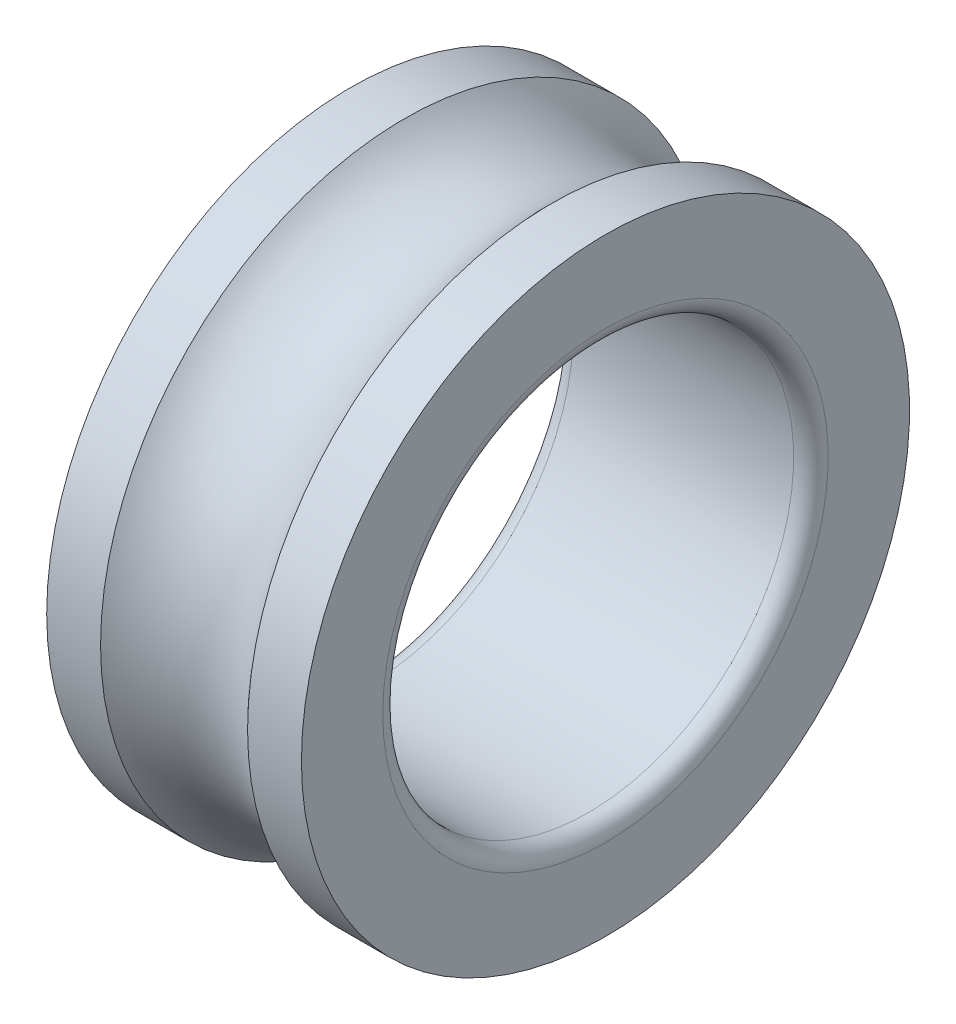
ISO-10303-21;
HEADER;
FILE_DESCRIPTION(('STEP AP214'),'2;1');
FILE_NAME('part.step','',(''),(''),'','','');
FILE_SCHEMA(('AUTOMOTIVE_DESIGN { 1 0 10303 214 1 1 1 1 }'));
ENDSEC;
DATA;
#1=APPLICATION_CONTEXT('core data for automotive mechanical design processes');
#2=APPLICATION_PROTOCOL_DEFINITION('international standard','automotive_design',2000,#1);
#3=PRODUCT_CONTEXT('',#1,'mechanical');
#4=PRODUCT('Part','Part','',(#3));
#5=PRODUCT_RELATED_PRODUCT_CATEGORY('part','',(#4));
#6=PRODUCT_DEFINITION_FORMATION('','',#4);
#7=PRODUCT_DEFINITION_CONTEXT('part definition',#1,'design');
#8=PRODUCT_DEFINITION('design','',#6,#7);
#9=PRODUCT_DEFINITION_SHAPE('','',#8);
#10=(LENGTH_UNIT() NAMED_UNIT(*) SI_UNIT(.MILLI.,.METRE.));
#11=(NAMED_UNIT(*) PLANE_ANGLE_UNIT() SI_UNIT($,.RADIAN.));
#12=(NAMED_UNIT(*) SI_UNIT($,.STERADIAN.) SOLID_ANGLE_UNIT());
#13=UNCERTAINTY_MEASURE_WITH_UNIT(LENGTH_MEASURE(1.E-05),#10,'distance_accuracy_value','');
#14=(GEOMETRIC_REPRESENTATION_CONTEXT(3) GLOBAL_UNCERTAINTY_ASSIGNED_CONTEXT((#13)) GLOBAL_UNIT_ASSIGNED_CONTEXT((#10,
#11,#12)) REPRESENTATION_CONTEXT('',''));
#15=CARTESIAN_POINT('',(0.,0.,0.));
#16=DIRECTION('',(0.,0.,1.));
#17=DIRECTION('',(1.,0.,0.));
#18=AXIS2_PLACEMENT_3D('',#15,#16,#17);
#19=CARTESIAN_POINT('',(-31.0723910879718,0.,0.));
#20=DIRECTION('',(-1.,0.,0.));
#21=DIRECTION('',(0.,0.,1.));
#22=AXIS2_PLACEMENT_3D('',#19,#20,#21);
#23=CYLINDRICAL_SURFACE('',#22,37.);
#24=CARTESIAN_POINT('',(8.94427190999915,0.,0.));
#25=DIRECTION('',(-1.,0.,0.));
#26=DIRECTION('',(0.,0.,1.));
#27=AXIS2_PLACEMENT_3D('',#24,#25,#26);
#28=CIRCLE('',#27,37.);
#29=CARTESIAN_POINT('',(8.94427190999915,0.,37.));
#30=VERTEX_POINT('',#29);
#31=EDGE_CURVE('E10',#30,#30,#28,.T.);
#32=ORIENTED_EDGE('',*,*,#31,.F.);
#33=EDGE_LOOP('',(#32));
#34=FACE_BOUND('',#33,.T.);
#35=CARTESIAN_POINT('',(15.5,0.,0.));
#36=DIRECTION('',(-1.,0.,0.));
#37=DIRECTION('',(0.,0.,1.));
#38=AXIS2_PLACEMENT_3D('',#35,#36,#37);
#39=CIRCLE('',#38,37.);
#40=CARTESIAN_POINT('',(15.5,0.,37.));
#41=VERTEX_POINT('',#40);
#42=EDGE_CURVE('E59',#41,#41,#39,.T.);
#43=ORIENTED_EDGE('',*,*,#42,.T.);
#44=EDGE_LOOP('',(#43));
#45=FACE_BOUND('',#44,.T.);
#46=ADVANCED_FACE('F31',(#34,#45),#23,.T.);
#47=CARTESIAN_POINT('',(0.,0.,0.));
#48=DIRECTION('',(-1.,0.,0.));
#49=DIRECTION('',(0.,0.,1.));
#50=AXIS2_PLACEMENT_3D('',#47,#48,#49);
#51=TOROIDAL_SURFACE('',#50,45.,12.);
#52=CARTESIAN_POINT('',(-8.94427190999917,0.,0.));
#53=DIRECTION('',(-1.,0.,0.));
#54=DIRECTION('',(0.,0.,1.));
#55=AXIS2_PLACEMENT_3D('',#52,#53,#54);
#56=CIRCLE('',#55,37.);
#57=CARTESIAN_POINT('',(-8.94427190999917,0.,37.));
#58=VERTEX_POINT('',#57);
#59=EDGE_CURVE('E37',#58,#58,#56,.T.);
#60=ORIENTED_EDGE('',*,*,#59,.F.);
#61=EDGE_LOOP('',(#60));
#62=FACE_BOUND('',#61,.T.);
#63=ORIENTED_EDGE('',*,*,#31,.T.);
#64=EDGE_LOOP('',(#63));
#65=FACE_BOUND('',#64,.T.);
#66=ADVANCED_FACE('F96',(#62,#65),#51,.F.);
#67=CARTESIAN_POINT('',(-31.0723910879718,0.,0.));
#68=DIRECTION('',(-1.,0.,0.));
#69=DIRECTION('',(0.,0.,1.));
#70=AXIS2_PLACEMENT_3D('',#67,#68,#69);
#71=CYLINDRICAL_SURFACE('',#70,37.);
#72=CARTESIAN_POINT('',(-15.5,0.,0.));
#73=DIRECTION('',(-1.,0.,0.));
#74=DIRECTION('',(0.,0.,1.));
#75=AXIS2_PLACEMENT_3D('',#72,#73,#74);
#76=CIRCLE('',#75,37.);
#77=CARTESIAN_POINT('',(-15.5,0.,37.));
#78=VERTEX_POINT('',#77);
#79=EDGE_CURVE('E41',#78,#78,#76,.T.);
#80=ORIENTED_EDGE('',*,*,#79,.F.);
#81=EDGE_LOOP('',(#80));
#82=FACE_BOUND('',#81,.T.);
#83=ORIENTED_EDGE('',*,*,#59,.T.);
#84=EDGE_LOOP('',(#83));
#85=FACE_BOUND('',#84,.T.);
#86=ADVANCED_FACE('F91',(#82,#85),#71,.T.);
#87=CARTESIAN_POINT('',(-15.5,27.1,0.));
#88=DIRECTION('',(1.,0.,0.));
#89=DIRECTION('',(0.,0.,-1.));
#90=AXIS2_PLACEMENT_3D('',#87,#88,#89);
#91=PLANE('',#90);
#92=CARTESIAN_POINT('',(-15.5,0.,0.));
#93=DIRECTION('',(-1.,0.,0.));
#94=DIRECTION('',(0.,0.,1.));
#95=AXIS2_PLACEMENT_3D('',#92,#93,#94);
#96=CIRCLE('',#95,27.1);
#97=CARTESIAN_POINT('',(-15.5,0.,27.1));
#98=VERTEX_POINT('',#97);
#99=EDGE_CURVE('E45',#98,#98,#96,.T.);
#100=ORIENTED_EDGE('',*,*,#99,.F.);
#101=EDGE_LOOP('',(#100));
#102=FACE_BOUND('',#101,.T.);
#103=ORIENTED_EDGE('',*,*,#79,.T.);
#104=EDGE_LOOP('',(#103));
#105=FACE_BOUND('',#104,.T.);
#106=ADVANCED_FACE('F85',(#102,#105),#91,.F.);
#107=CARTESIAN_POINT('',(-13.4,0.,0.));
#108=DIRECTION('',(-1.,0.,0.));
#109=DIRECTION('',(0.,0.,1.));
#110=AXIS2_PLACEMENT_3D('',#107,#108,#109);
#111=TOROIDAL_SURFACE('',#110,27.1,2.1);
#112=CARTESIAN_POINT('',(-13.4,0.,0.));
#113=DIRECTION('',(-1.,0.,0.));
#114=DIRECTION('',(0.,0.,1.));
#115=AXIS2_PLACEMENT_3D('',#112,#113,#114);
#116=CIRCLE('',#115,25.);
#117=CARTESIAN_POINT('',(-13.4,0.,25.));
#118=VERTEX_POINT('',#117);
#119=EDGE_CURVE('E50',#118,#118,#116,.T.);
#120=ORIENTED_EDGE('',*,*,#119,.F.);
#121=EDGE_LOOP('',(#120));
#122=FACE_BOUND('',#121,.T.);
#123=ORIENTED_EDGE('',*,*,#99,.T.);
#124=EDGE_LOOP('',(#123));
#125=FACE_BOUND('',#124,.T.);
#126=ADVANCED_FACE('F79',(#122,#125),#111,.T.);
#127=CARTESIAN_POINT('',(-31.0723910879718,0.,0.));
#128=DIRECTION('',(-1.,0.,0.));
#129=DIRECTION('',(0.,0.,1.));
#130=AXIS2_PLACEMENT_3D('',#127,#128,#129);
#131=CYLINDRICAL_SURFACE('',#130,25.);
#132=CARTESIAN_POINT('',(13.4,0.,0.));
#133=DIRECTION('',(-1.,0.,0.));
#134=DIRECTION('',(0.,0.,1.));
#135=AXIS2_PLACEMENT_3D('',#132,#133,#134);
#136=CIRCLE('',#135,25.);
#137=CARTESIAN_POINT('',(13.4,0.,25.));
#138=VERTEX_POINT('',#137);
#139=EDGE_CURVE('E53',#138,#138,#136,.T.);
#140=ORIENTED_EDGE('',*,*,#139,.F.);
#141=EDGE_LOOP('',(#140));
#142=FACE_BOUND('',#141,.T.);
#143=ORIENTED_EDGE('',*,*,#119,.T.);
#144=EDGE_LOOP('',(#143));
#145=FACE_BOUND('',#144,.T.);
#146=ADVANCED_FACE('F73',(#142,#145),#131,.F.);
#147=CARTESIAN_POINT('',(13.4,0.,0.));
#148=DIRECTION('',(-1.,0.,0.));
#149=DIRECTION('',(0.,0.,1.));
#150=AXIS2_PLACEMENT_3D('',#147,#148,#149);
#151=TOROIDAL_SURFACE('',#150,27.1,2.1);
#152=CARTESIAN_POINT('',(15.5,0.,0.));
#153=DIRECTION('',(-1.,0.,0.));
#154=DIRECTION('',(0.,0.,1.));
#155=AXIS2_PLACEMENT_3D('',#152,#153,#154);
#156=CIRCLE('',#155,27.1);
#157=CARTESIAN_POINT('',(15.5,0.,27.1));
#158=VERTEX_POINT('',#157);
#159=EDGE_CURVE('E56',#158,#158,#156,.T.);
#160=ORIENTED_EDGE('',*,*,#159,.F.);
#161=EDGE_LOOP('',(#160));
#162=FACE_BOUND('',#161,.T.);
#163=ORIENTED_EDGE('',*,*,#139,.T.);
#164=EDGE_LOOP('',(#163));
#165=FACE_BOUND('',#164,.T.);
#166=ADVANCED_FACE('F67',(#162,#165),#151,.T.);
#167=CARTESIAN_POINT('',(15.5,27.1,0.));
#168=DIRECTION('',(-1.,0.,0.));
#169=DIRECTION('',(0.,0.,1.));
#170=AXIS2_PLACEMENT_3D('',#167,#168,#169);
#171=PLANE('',#170);
#172=ORIENTED_EDGE('',*,*,#42,.F.);
#173=EDGE_LOOP('',(#172));
#174=FACE_BOUND('',#173,.T.);
#175=ORIENTED_EDGE('',*,*,#159,.T.);
#176=EDGE_LOOP('',(#175));
#177=FACE_BOUND('',#176,.T.);
#178=ADVANCED_FACE('F64',(#174,#177),#171,.F.);
#179=CLOSED_SHELL('',(#46,#66,#86,#106,#126,#146,#166,#178));
#180=MANIFOLD_SOLID_BREP('B2',#179);
#181=ADVANCED_BREP_SHAPE_REPRESENTATION('',(#18,#180),#14);
#182=SHAPE_DEFINITION_REPRESENTATION(#9,#181);
ENDSEC;
END-ISO-10303-21;
